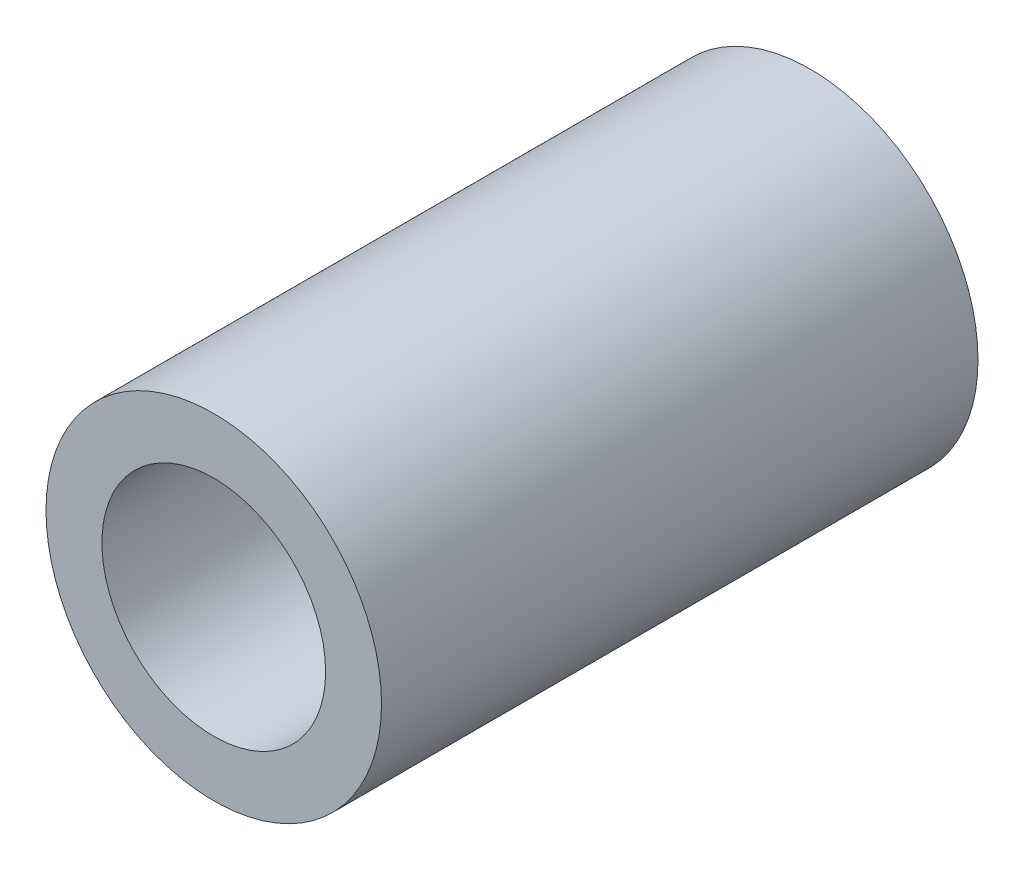
ISO-10303-21;
HEADER;
FILE_DESCRIPTION(('STEP AP214'),'2;1');
FILE_NAME('part.step','',(''),(''),'','','');
FILE_SCHEMA(('AUTOMOTIVE_DESIGN { 1 0 10303 214 1 1 1 1 }'));
ENDSEC;
DATA;
#1=APPLICATION_CONTEXT('core data for automotive mechanical design processes');
#2=APPLICATION_PROTOCOL_DEFINITION('international standard','automotive_design',2000,#1);
#3=PRODUCT_CONTEXT('',#1,'mechanical');
#4=PRODUCT('Part','Part','',(#3));
#5=PRODUCT_RELATED_PRODUCT_CATEGORY('part','',(#4));
#6=PRODUCT_DEFINITION_FORMATION('','',#4);
#7=PRODUCT_DEFINITION_CONTEXT('part definition',#1,'design');
#8=PRODUCT_DEFINITION('design','',#6,#7);
#9=PRODUCT_DEFINITION_SHAPE('','',#8);
#10=(LENGTH_UNIT() NAMED_UNIT(*) SI_UNIT(.MILLI.,.METRE.));
#11=(NAMED_UNIT(*) PLANE_ANGLE_UNIT() SI_UNIT($,.RADIAN.));
#12=(NAMED_UNIT(*) SI_UNIT($,.STERADIAN.) SOLID_ANGLE_UNIT());
#13=UNCERTAINTY_MEASURE_WITH_UNIT(LENGTH_MEASURE(1.E-05),#10,'distance_accuracy_value','');
#14=(GEOMETRIC_REPRESENTATION_CONTEXT(3) GLOBAL_UNCERTAINTY_ASSIGNED_CONTEXT((#13)) GLOBAL_UNIT_ASSIGNED_CONTEXT((#10,
#11,#12)) REPRESENTATION_CONTEXT('',''));
#15=CARTESIAN_POINT('',(0.,0.,0.));
#16=DIRECTION('',(0.,0.,1.));
#17=DIRECTION('',(1.,0.,0.));
#18=AXIS2_PLACEMENT_3D('',#15,#16,#17);
#19=CARTESIAN_POINT('',(0.,0.,16.));
#20=DIRECTION('',(0.,0.,1.));
#21=DIRECTION('',(1.,0.,0.));
#22=AXIS2_PLACEMENT_3D('',#19,#20,#21);
#23=PLANE('',#22);
#24=CARTESIAN_POINT('',(0.,0.,16.));
#25=DIRECTION('',(0.,0.,1.));
#26=DIRECTION('',(1.,0.,0.));
#27=AXIS2_PLACEMENT_3D('',#24,#25,#26);
#28=CIRCLE('',#27,9.);
#29=CARTESIAN_POINT('',(9.,0.,16.));
#30=VERTEX_POINT('',#29);
#31=EDGE_CURVE('E10',#30,#30,#28,.T.);
#32=ORIENTED_EDGE('',*,*,#31,.T.);
#33=EDGE_LOOP('',(#32));
#34=FACE_BOUND('',#33,.T.);
#35=CARTESIAN_POINT('',(0.,0.,16.));
#36=DIRECTION('',(0.,0.,1.));
#37=DIRECTION('',(1.,0.,0.));
#38=AXIS2_PLACEMENT_3D('',#35,#36,#37);
#39=CIRCLE('',#38,6.);
#40=CARTESIAN_POINT('',(6.,0.,16.));
#41=VERTEX_POINT('',#40);
#42=EDGE_CURVE('E41',#41,#41,#39,.T.);
#43=ORIENTED_EDGE('',*,*,#42,.F.);
#44=EDGE_LOOP('',(#43));
#45=FACE_BOUND('',#44,.T.);
#46=ADVANCED_FACE('F30',(#34,#45),#23,.T.);
#47=CARTESIAN_POINT('',(0.,0.,-16.));
#48=DIRECTION('',(0.,0.,1.));
#49=DIRECTION('',(1.,0.,0.));
#50=AXIS2_PLACEMENT_3D('',#47,#48,#49);
#51=PLANE('',#50);
#52=CARTESIAN_POINT('',(0.,0.,-16.));
#53=DIRECTION('',(0.,0.,1.));
#54=DIRECTION('',(1.,0.,0.));
#55=AXIS2_PLACEMENT_3D('',#52,#53,#54);
#56=CIRCLE('',#55,9.);
#57=CARTESIAN_POINT('',(9.,0.,-16.));
#58=VERTEX_POINT('',#57);
#59=EDGE_CURVE('E34',#58,#58,#56,.T.);
#60=ORIENTED_EDGE('',*,*,#59,.F.);
#61=EDGE_LOOP('',(#60));
#62=FACE_BOUND('',#61,.T.);
#63=CARTESIAN_POINT('',(0.,0.,-16.));
#64=DIRECTION('',(0.,0.,1.));
#65=DIRECTION('',(1.,0.,0.));
#66=AXIS2_PLACEMENT_3D('',#63,#64,#65);
#67=CIRCLE('',#66,6.);
#68=CARTESIAN_POINT('',(6.,0.,-16.));
#69=VERTEX_POINT('',#68);
#70=EDGE_CURVE('E43',#69,#69,#67,.T.);
#71=ORIENTED_EDGE('',*,*,#70,.T.);
#72=EDGE_LOOP('',(#71));
#73=FACE_BOUND('',#72,.T.);
#74=ADVANCED_FACE('F53',(#62,#73),#51,.F.);
#75=CARTESIAN_POINT('',(0.,0.,16.));
#76=DIRECTION('',(0.,0.,-1.));
#77=DIRECTION('',(-1.,0.,0.));
#78=AXIS2_PLACEMENT_3D('',#75,#76,#77);
#79=CYLINDRICAL_SURFACE('',#78,9.);
#80=ORIENTED_EDGE('',*,*,#31,.F.);
#81=EDGE_LOOP('',(#80));
#82=FACE_BOUND('',#81,.T.);
#83=ORIENTED_EDGE('',*,*,#59,.T.);
#84=EDGE_LOOP('',(#83));
#85=FACE_BOUND('',#84,.T.);
#86=ADVANCED_FACE('F32',(#82,#85),#79,.T.);
#87=CARTESIAN_POINT('',(0.,0.,16.));
#88=DIRECTION('',(0.,0.,-1.));
#89=DIRECTION('',(-1.,0.,0.));
#90=AXIS2_PLACEMENT_3D('',#87,#88,#89);
#91=CYLINDRICAL_SURFACE('',#90,6.);
#92=ORIENTED_EDGE('',*,*,#42,.T.);
#93=EDGE_LOOP('',(#92));
#94=FACE_BOUND('',#93,.T.);
#95=ORIENTED_EDGE('',*,*,#70,.F.);
#96=EDGE_LOOP('',(#95));
#97=FACE_BOUND('',#96,.T.);
#98=ADVANCED_FACE('F49',(#94,#97),#91,.F.);
#99=CLOSED_SHELL('',(#46,#74,#86,#98));
#100=MANIFOLD_SOLID_BREP('B2',#99);
#101=ADVANCED_BREP_SHAPE_REPRESENTATION('',(#18,#100),#14);
#102=SHAPE_DEFINITION_REPRESENTATION(#9,#101);
ENDSEC;
END-ISO-10303-21;
